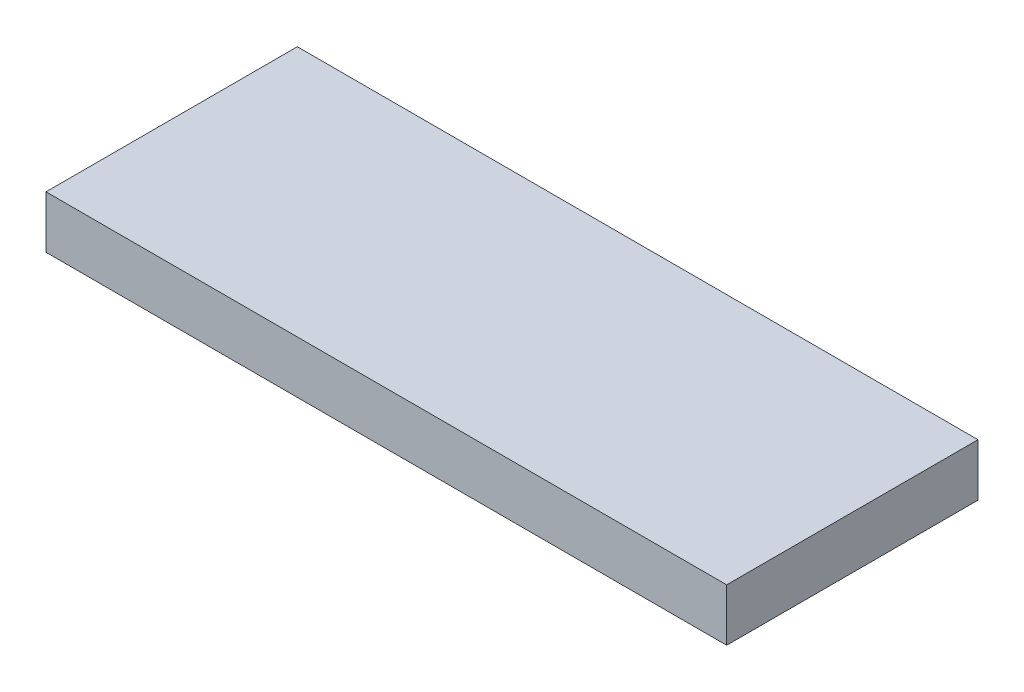
ISO-10303-21;
HEADER;
FILE_DESCRIPTION(('STEP AP214'),'2;1');
FILE_NAME('part.step','',(''),(''),'','','');
FILE_SCHEMA(('AUTOMOTIVE_DESIGN { 1 0 10303 214 1 1 1 1 }'));
ENDSEC;
DATA;
#1=APPLICATION_CONTEXT('core data for automotive mechanical design processes');
#2=APPLICATION_PROTOCOL_DEFINITION('international standard','automotive_design',2000,#1);
#3=PRODUCT_CONTEXT('',#1,'mechanical');
#4=PRODUCT('Part','Part','',(#3));
#5=PRODUCT_RELATED_PRODUCT_CATEGORY('part','',(#4));
#6=PRODUCT_DEFINITION_FORMATION('','',#4);
#7=PRODUCT_DEFINITION_CONTEXT('part definition',#1,'design');
#8=PRODUCT_DEFINITION('design','',#6,#7);
#9=PRODUCT_DEFINITION_SHAPE('','',#8);
#10=(LENGTH_UNIT() NAMED_UNIT(*) SI_UNIT(.MILLI.,.METRE.));
#11=(NAMED_UNIT(*) PLANE_ANGLE_UNIT() SI_UNIT($,.RADIAN.));
#12=(NAMED_UNIT(*) SI_UNIT($,.STERADIAN.) SOLID_ANGLE_UNIT());
#13=UNCERTAINTY_MEASURE_WITH_UNIT(LENGTH_MEASURE(1.E-05),#10,'distance_accuracy_value','');
#14=(GEOMETRIC_REPRESENTATION_CONTEXT(3) GLOBAL_UNCERTAINTY_ASSIGNED_CONTEXT((#13)) GLOBAL_UNIT_ASSIGNED_CONTEXT((#10,
#11,#12)) REPRESENTATION_CONTEXT('',''));
#15=CARTESIAN_POINT('',(0.,0.,0.));
#16=DIRECTION('',(0.,0.,1.));
#17=DIRECTION('',(1.,0.,0.));
#18=AXIS2_PLACEMENT_3D('',#15,#16,#17);
#19=CARTESIAN_POINT('',(-6.5,1.,2.4));
#20=DIRECTION('',(1.,0.,0.));
#21=DIRECTION('',(0.,0.,-1.));
#22=AXIS2_PLACEMENT_3D('',#19,#20,#21);
#23=PLANE('',#22);
#24=DIRECTION('',(0.,0.,1.));
#25=VECTOR('',#24,1.);
#26=CARTESIAN_POINT('',(-6.5,0.,2.4));
#27=LINE('',#26,#25);
#28=CARTESIAN_POINT('',(-6.5,0.,-2.4));
#29=VERTEX_POINT('',#28);
#30=CARTESIAN_POINT('',(-6.5,0.,2.4));
#31=VERTEX_POINT('',#30);
#32=EDGE_CURVE('E96',#29,#31,#27,.T.);
#33=ORIENTED_EDGE('',*,*,#32,.T.);
#34=DIRECTION('',(0.,-1.,0.));
#35=VECTOR('',#34,1.);
#36=CARTESIAN_POINT('',(-6.5,1.,2.4));
#37=LINE('',#36,#35);
#38=CARTESIAN_POINT('',(-6.5,1.,2.4));
#39=VERTEX_POINT('',#38);
#40=EDGE_CURVE('E11',#39,#31,#37,.T.);
#41=ORIENTED_EDGE('',*,*,#40,.F.);
#42=DIRECTION('',(0.,0.,1.));
#43=VECTOR('',#42,1.);
#44=CARTESIAN_POINT('',(-6.5,1.,2.4));
#45=LINE('',#44,#43);
#46=CARTESIAN_POINT('',(-6.5,1.,-2.4));
#47=VERTEX_POINT('',#46);
#48=EDGE_CURVE('E84',#47,#39,#45,.T.);
#49=ORIENTED_EDGE('',*,*,#48,.F.);
#50=DIRECTION('',(0.,-1.,0.));
#51=VECTOR('',#50,1.);
#52=CARTESIAN_POINT('',(-6.5,1.,-2.4));
#53=LINE('',#52,#51);
#54=EDGE_CURVE('E92',#47,#29,#53,.T.);
#55=ORIENTED_EDGE('',*,*,#54,.T.);
#56=EDGE_LOOP('',(#33,#41,#49,#55));
#57=FACE_BOUND('',#56,.T.);
#58=ADVANCED_FACE('F33',(#57),#23,.F.);
#59=CARTESIAN_POINT('',(6.5,1.,2.4));
#60=DIRECTION('',(0.,0.,-1.));
#61=DIRECTION('',(-1.,0.,0.));
#62=AXIS2_PLACEMENT_3D('',#59,#60,#61);
#63=PLANE('',#62);
#64=DIRECTION('',(1.,0.,0.));
#65=VECTOR('',#64,1.);
#66=CARTESIAN_POINT('',(6.5,0.,2.4));
#67=LINE('',#66,#65);
#68=CARTESIAN_POINT('',(6.5,0.,2.4));
#69=VERTEX_POINT('',#68);
#70=EDGE_CURVE('E88',#31,#69,#67,.T.);
#71=ORIENTED_EDGE('',*,*,#70,.T.);
#72=DIRECTION('',(0.,-1.,0.));
#73=VECTOR('',#72,1.);
#74=CARTESIAN_POINT('',(6.5,1.,2.4));
#75=LINE('',#74,#73);
#76=CARTESIAN_POINT('',(6.5,1.,2.4));
#77=VERTEX_POINT('',#76);
#78=EDGE_CURVE('E41',#77,#69,#75,.T.);
#79=ORIENTED_EDGE('',*,*,#78,.F.);
#80=DIRECTION('',(1.,0.,0.));
#81=VECTOR('',#80,1.);
#82=CARTESIAN_POINT('',(6.5,1.,2.4));
#83=LINE('',#82,#81);
#84=EDGE_CURVE('E79',#39,#77,#83,.T.);
#85=ORIENTED_EDGE('',*,*,#84,.F.);
#86=ORIENTED_EDGE('',*,*,#40,.T.);
#87=EDGE_LOOP('',(#71,#79,#85,#86));
#88=FACE_BOUND('',#87,.T.);
#89=ADVANCED_FACE('F87',(#88),#63,.F.);
#90=CARTESIAN_POINT('',(6.5,1.,2.4));
#91=DIRECTION('',(-1.,0.,0.));
#92=DIRECTION('',(0.,0.,1.));
#93=AXIS2_PLACEMENT_3D('',#90,#91,#92);
#94=PLANE('',#93);
#95=DIRECTION('',(0.,0.,-1.));
#96=VECTOR('',#95,1.);
#97=CARTESIAN_POINT('',(6.5,0.,2.4));
#98=LINE('',#97,#96);
#99=CARTESIAN_POINT('',(6.5,0.,-2.4));
#100=VERTEX_POINT('',#99);
#101=EDGE_CURVE('E66',#69,#100,#98,.T.);
#102=ORIENTED_EDGE('',*,*,#101,.T.);
#103=DIRECTION('',(0.,-1.,0.));
#104=VECTOR('',#103,1.);
#105=CARTESIAN_POINT('',(6.5,1.,-2.4));
#106=LINE('',#105,#104);
#107=CARTESIAN_POINT('',(6.5,1.,-2.4));
#108=VERTEX_POINT('',#107);
#109=EDGE_CURVE('E89',#108,#100,#106,.T.);
#110=ORIENTED_EDGE('',*,*,#109,.F.);
#111=DIRECTION('',(0.,0.,-1.));
#112=VECTOR('',#111,1.);
#113=CARTESIAN_POINT('',(6.5,1.,2.4));
#114=LINE('',#113,#112);
#115=EDGE_CURVE('E82',#77,#108,#114,.T.);
#116=ORIENTED_EDGE('',*,*,#115,.F.);
#117=ORIENTED_EDGE('',*,*,#78,.T.);
#118=EDGE_LOOP('',(#102,#110,#116,#117));
#119=FACE_BOUND('',#118,.T.);
#120=ADVANCED_FACE('F90',(#119),#94,.F.);
#121=CARTESIAN_POINT('',(6.5,1.,-2.4));
#122=DIRECTION('',(0.,0.,1.));
#123=DIRECTION('',(1.,0.,0.));
#124=AXIS2_PLACEMENT_3D('',#121,#122,#123);
#125=PLANE('',#124);
#126=DIRECTION('',(-1.,0.,0.));
#127=VECTOR('',#126,1.);
#128=CARTESIAN_POINT('',(6.5,0.,-2.4));
#129=LINE('',#128,#127);
#130=EDGE_CURVE('E72',#100,#29,#129,.T.);
#131=ORIENTED_EDGE('',*,*,#130,.T.);
#132=ORIENTED_EDGE('',*,*,#54,.F.);
#133=DIRECTION('',(-1.,0.,0.));
#134=VECTOR('',#133,1.);
#135=CARTESIAN_POINT('',(6.5,1.,-2.4));
#136=LINE('',#135,#134);
#137=EDGE_CURVE('E49',#108,#47,#136,.T.);
#138=ORIENTED_EDGE('',*,*,#137,.F.);
#139=ORIENTED_EDGE('',*,*,#109,.T.);
#140=EDGE_LOOP('',(#131,#132,#138,#139));
#141=FACE_BOUND('',#140,.T.);
#142=ADVANCED_FACE('F103',(#141),#125,.F.);
#143=CARTESIAN_POINT('',(0.,1.,0.));
#144=DIRECTION('',(0.,1.,0.));
#145=DIRECTION('',(0.,0.,1.));
#146=AXIS2_PLACEMENT_3D('',#143,#144,#145);
#147=PLANE('',#146);
#148=ORIENTED_EDGE('',*,*,#48,.T.);
#149=ORIENTED_EDGE('',*,*,#84,.T.);
#150=ORIENTED_EDGE('',*,*,#115,.T.);
#151=ORIENTED_EDGE('',*,*,#137,.T.);
#152=EDGE_LOOP('',(#148,#149,#150,#151));
#153=FACE_BOUND('',#152,.T.);
#154=ADVANCED_FACE('F80',(#153),#147,.T.);
#155=CARTESIAN_POINT('',(0.,0.,0.));
#156=DIRECTION('',(0.,1.,0.));
#157=DIRECTION('',(0.,0.,1.));
#158=AXIS2_PLACEMENT_3D('',#155,#156,#157);
#159=PLANE('',#158);
#160=ORIENTED_EDGE('',*,*,#32,.F.);
#161=ORIENTED_EDGE('',*,*,#130,.F.);
#162=ORIENTED_EDGE('',*,*,#101,.F.);
#163=ORIENTED_EDGE('',*,*,#70,.F.);
#164=EDGE_LOOP('',(#160,#161,#162,#163));
#165=FACE_BOUND('',#164,.T.);
#166=ADVANCED_FACE('F106',(#165),#159,.F.);
#167=CLOSED_SHELL('',(#58,#89,#120,#142,#154,#166));
#168=MANIFOLD_SOLID_BREP('B2',#167);
#169=ADVANCED_BREP_SHAPE_REPRESENTATION('',(#18,#168),#14);
#170=SHAPE_DEFINITION_REPRESENTATION(#9,#169);
ENDSEC;
END-ISO-10303-21;
